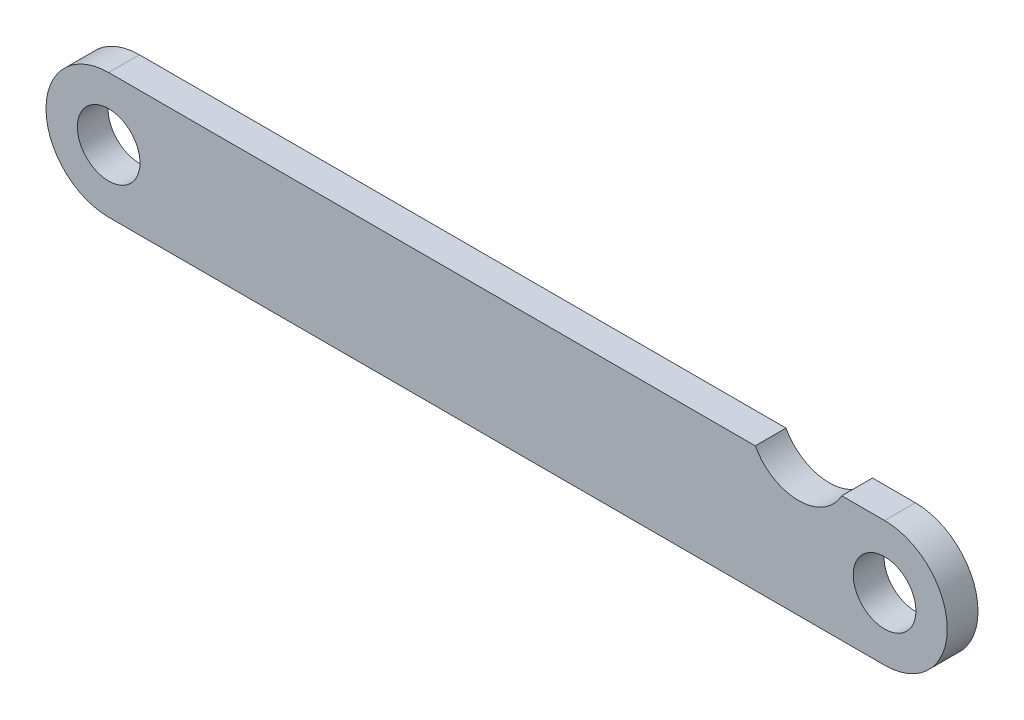
ISO-10303-21;
HEADER;
FILE_DESCRIPTION(('STEP AP214'),'2;1');
FILE_NAME('part.step','',(''),(''),'','','');
FILE_SCHEMA(('AUTOMOTIVE_DESIGN { 1 0 10303 214 1 1 1 1 }'));
ENDSEC;
DATA;
#1=APPLICATION_CONTEXT('core data for automotive mechanical design processes');
#2=APPLICATION_PROTOCOL_DEFINITION('international standard','automotive_design',2000,#1);
#3=PRODUCT_CONTEXT('',#1,'mechanical');
#4=PRODUCT('Part','Part','',(#3));
#5=PRODUCT_RELATED_PRODUCT_CATEGORY('part','',(#4));
#6=PRODUCT_DEFINITION_FORMATION('','',#4);
#7=PRODUCT_DEFINITION_CONTEXT('part definition',#1,'design');
#8=PRODUCT_DEFINITION('design','',#6,#7);
#9=PRODUCT_DEFINITION_SHAPE('','',#8);
#10=(LENGTH_UNIT() NAMED_UNIT(*) SI_UNIT(.MILLI.,.METRE.));
#11=(NAMED_UNIT(*) PLANE_ANGLE_UNIT() SI_UNIT($,.RADIAN.));
#12=(NAMED_UNIT(*) SI_UNIT($,.STERADIAN.) SOLID_ANGLE_UNIT());
#13=UNCERTAINTY_MEASURE_WITH_UNIT(LENGTH_MEASURE(1.E-05),#10,'distance_accuracy_value','');
#14=(GEOMETRIC_REPRESENTATION_CONTEXT(3) GLOBAL_UNCERTAINTY_ASSIGNED_CONTEXT((#13)) GLOBAL_UNIT_ASSIGNED_CONTEXT((#10,
#11,#12)) REPRESENTATION_CONTEXT('',''));
#15=CARTESIAN_POINT('',(0.,0.,0.));
#16=DIRECTION('',(0.,0.,1.));
#17=DIRECTION('',(1.,0.,0.));
#18=AXIS2_PLACEMENT_3D('',#15,#16,#17);
#19=CARTESIAN_POINT('',(0.,2.03803107941855,1.));
#20=DIRECTION('',(0.,1.,0.));
#21=DIRECTION('',(-1.,0.,0.));
#22=AXIS2_PLACEMENT_3D('',#19,#20,#21);
#23=PLANE('',#22);
#24=DIRECTION('',(1.,0.,0.));
#25=VECTOR('',#24,1.);
#26=CARTESIAN_POINT('',(0.,2.03803107941855,0.));
#27=LINE('',#26,#25);
#28=CARTESIAN_POINT('',(-1.39308729337321,2.03803107941855,0.));
#29=VERTEX_POINT('',#28);
#30=CARTESIAN_POINT('',(0.,2.03803107941855,0.));
#31=VERTEX_POINT('',#30);
#32=EDGE_CURVE('E94',#29,#31,#27,.T.);
#33=ORIENTED_EDGE('',*,*,#32,.F.);
#34=DIRECTION('',(0.,0.,-1.));
#35=VECTOR('',#34,1.);
#36=CARTESIAN_POINT('',(-1.39308729337321,2.03803107941855,1.));
#37=LINE('',#36,#35);
#38=CARTESIAN_POINT('',(-1.39308729337321,2.03803107941855,1.));
#39=VERTEX_POINT('',#38);
#40=EDGE_CURVE('E65',#29,#39,#37,.F.);
#41=ORIENTED_EDGE('',*,*,#40,.T.);
#42=DIRECTION('',(1.,0.,0.));
#43=VECTOR('',#42,1.);
#44=CARTESIAN_POINT('',(0.,2.03803107941855,1.));
#45=LINE('',#44,#43);
#46=CARTESIAN_POINT('',(0.,2.03803107941855,1.));
#47=VERTEX_POINT('',#46);
#48=EDGE_CURVE('E73',#39,#47,#45,.T.);
#49=ORIENTED_EDGE('',*,*,#48,.T.);
#50=DIRECTION('',(0.,0.,-1.));
#51=VECTOR('',#50,1.);
#52=CARTESIAN_POINT('',(0.,2.03803107941855,1.));
#53=LINE('',#52,#51);
#54=EDGE_CURVE('E139',#47,#31,#53,.T.);
#55=ORIENTED_EDGE('',*,*,#54,.T.);
#56=EDGE_LOOP('',(#33,#41,#49,#55));
#57=FACE_BOUND('',#56,.T.);
#58=ADVANCED_FACE('F51',(#57),#23,.T.);
#59=CARTESIAN_POINT('',(-25.234342,2.03803107941855,1.));
#60=VERTEX_POINT('',#59);
#61=CARTESIAN_POINT('',(-4.2069127066268,2.03803107941855,1.));
#62=VERTEX_POINT('',#61);
#63=EDGE_CURVE('E120',#60,#62,#45,.T.);
#64=ORIENTED_EDGE('',*,*,#63,.T.);
#65=DIRECTION('',(0.,0.,-1.));
#66=VECTOR('',#65,1.);
#67=CARTESIAN_POINT('',(-4.2069127066268,2.03803107941855,1.));
#68=LINE('',#67,#66);
#69=CARTESIAN_POINT('',(-4.2069127066268,2.03803107941855,0.));
#70=VERTEX_POINT('',#69);
#71=EDGE_CURVE('E109',#62,#70,#68,.T.);
#72=ORIENTED_EDGE('',*,*,#71,.T.);
#73=CARTESIAN_POINT('',(-25.234342,2.03803107941855,0.));
#74=VERTEX_POINT('',#73);
#75=EDGE_CURVE('E140',#74,#70,#27,.T.);
#76=ORIENTED_EDGE('',*,*,#75,.F.);
#77=DIRECTION('',(0.,0.,-1.));
#78=VECTOR('',#77,1.);
#79=CARTESIAN_POINT('',(-25.234342,2.03803107941855,1.));
#80=LINE('',#79,#78);
#81=EDGE_CURVE('E13',#60,#74,#80,.T.);
#82=ORIENTED_EDGE('',*,*,#81,.F.);
#83=EDGE_LOOP('',(#64,#72,#76,#82));
#84=FACE_BOUND('',#83,.T.);
#85=ADVANCED_FACE('F122',(#84),#23,.T.);
#86=CARTESIAN_POINT('',(-25.234342,0.,1.));
#87=DIRECTION('',(0.,0.,-1.));
#88=DIRECTION('',(-1.,0.,0.));
#89=AXIS2_PLACEMENT_3D('',#86,#87,#88);
#90=CYLINDRICAL_SURFACE('',#89,2.03803107941855);
#91=CARTESIAN_POINT('',(-25.234342,0.,0.));
#92=DIRECTION('',(0.,0.,1.));
#93=DIRECTION('',(1.,0.,0.));
#94=AXIS2_PLACEMENT_3D('',#91,#92,#93);
#95=CIRCLE('',#94,2.03803107941855);
#96=CARTESIAN_POINT('',(-25.234342,-2.03803107941855,0.));
#97=VERTEX_POINT('',#96);
#98=EDGE_CURVE('E142',#74,#97,#95,.T.);
#99=ORIENTED_EDGE('',*,*,#98,.T.);
#100=DIRECTION('',(0.,0.,-1.));
#101=VECTOR('',#100,1.);
#102=CARTESIAN_POINT('',(-25.234342,-2.03803107941855,1.));
#103=LINE('',#102,#101);
#104=CARTESIAN_POINT('',(-25.234342,-2.03803107941855,1.));
#105=VERTEX_POINT('',#104);
#106=EDGE_CURVE('E58',#105,#97,#103,.T.);
#107=ORIENTED_EDGE('',*,*,#106,.F.);
#108=CARTESIAN_POINT('',(-25.234342,0.,1.));
#109=DIRECTION('',(0.,0.,1.));
#110=DIRECTION('',(1.,0.,0.));
#111=AXIS2_PLACEMENT_3D('',#108,#109,#110);
#112=CIRCLE('',#111,2.03803107941855);
#113=EDGE_CURVE('E123',#60,#105,#112,.T.);
#114=ORIENTED_EDGE('',*,*,#113,.F.);
#115=ORIENTED_EDGE('',*,*,#81,.T.);
#116=EDGE_LOOP('',(#99,#107,#114,#115));
#117=FACE_BOUND('',#116,.T.);
#118=ADVANCED_FACE('F172',(#117),#90,.T.);
#119=CARTESIAN_POINT('',(0.,-2.03803107941855,1.));
#120=DIRECTION('',(0.,1.,0.));
#121=DIRECTION('',(-1.,0.,0.));
#122=AXIS2_PLACEMENT_3D('',#119,#120,#121);
#123=PLANE('',#122);
#124=DIRECTION('',(1.,0.,0.));
#125=VECTOR('',#124,1.);
#126=CARTESIAN_POINT('',(0.,-2.03803107941855,0.));
#127=LINE('',#126,#125);
#128=CARTESIAN_POINT('',(0.,-2.03803107941855,0.));
#129=VERTEX_POINT('',#128);
#130=EDGE_CURVE('E144',#97,#129,#127,.T.);
#131=ORIENTED_EDGE('',*,*,#130,.T.);
#132=DIRECTION('',(0.,0.,-1.));
#133=VECTOR('',#132,1.);
#134=CARTESIAN_POINT('',(0.,-2.03803107941855,1.));
#135=LINE('',#134,#133);
#136=CARTESIAN_POINT('',(0.,-2.03803107941855,1.));
#137=VERTEX_POINT('',#136);
#138=EDGE_CURVE('E155',#137,#129,#135,.T.);
#139=ORIENTED_EDGE('',*,*,#138,.F.);
#140=DIRECTION('',(1.,0.,0.));
#141=VECTOR('',#140,1.);
#142=CARTESIAN_POINT('',(0.,-2.03803107941855,1.));
#143=LINE('',#142,#141);
#144=EDGE_CURVE('E125',#105,#137,#143,.T.);
#145=ORIENTED_EDGE('',*,*,#144,.F.);
#146=ORIENTED_EDGE('',*,*,#106,.T.);
#147=EDGE_LOOP('',(#131,#139,#145,#146));
#148=FACE_BOUND('',#147,.T.);
#149=ADVANCED_FACE('F162',(#148),#123,.F.);
#150=CARTESIAN_POINT('',(0.,0.,1.));
#151=DIRECTION('',(0.,0.,-1.));
#152=DIRECTION('',(-1.,0.,0.));
#153=AXIS2_PLACEMENT_3D('',#150,#151,#152);
#154=CYLINDRICAL_SURFACE('',#153,1.01901553970927);
#155=CARTESIAN_POINT('',(0.,0.,1.));
#156=DIRECTION('',(0.,0.,1.));
#157=DIRECTION('',(1.,0.,0.));
#158=AXIS2_PLACEMENT_3D('',#155,#156,#157);
#159=CIRCLE('',#158,1.01901553970927);
#160=CARTESIAN_POINT('',(1.01901553970927,0.,1.));
#161=VERTEX_POINT('',#160);
#162=EDGE_CURVE('E133',#161,#161,#159,.T.);
#163=ORIENTED_EDGE('',*,*,#162,.T.);
#164=EDGE_LOOP('',(#163));
#165=FACE_BOUND('',#164,.T.);
#166=CARTESIAN_POINT('',(0.,0.,0.));
#167=DIRECTION('',(0.,0.,1.));
#168=DIRECTION('',(1.,0.,0.));
#169=AXIS2_PLACEMENT_3D('',#166,#167,#168);
#170=CIRCLE('',#169,1.01901553970927);
#171=CARTESIAN_POINT('',(1.01901553970927,0.,0.));
#172=VERTEX_POINT('',#171);
#173=EDGE_CURVE('E149',#172,#172,#170,.T.);
#174=ORIENTED_EDGE('',*,*,#173,.F.);
#175=EDGE_LOOP('',(#174));
#176=FACE_BOUND('',#175,.T.);
#177=ADVANCED_FACE('F178',(#165,#176),#154,.F.);
#178=CARTESIAN_POINT('',(0.,0.,1.));
#179=DIRECTION('',(0.,0.,-1.));
#180=DIRECTION('',(-1.,0.,0.));
#181=AXIS2_PLACEMENT_3D('',#178,#179,#180);
#182=CYLINDRICAL_SURFACE('',#181,2.03803107941855);
#183=CARTESIAN_POINT('',(0.,0.,0.));
#184=DIRECTION('',(0.,0.,1.));
#185=DIRECTION('',(1.,0.,0.));
#186=AXIS2_PLACEMENT_3D('',#183,#184,#185);
#187=CIRCLE('',#186,2.03803107941855);
#188=EDGE_CURVE('E146',#129,#31,#187,.T.);
#189=ORIENTED_EDGE('',*,*,#188,.T.);
#190=ORIENTED_EDGE('',*,*,#54,.F.);
#191=CARTESIAN_POINT('',(0.,0.,1.));
#192=DIRECTION('',(0.,0.,1.));
#193=DIRECTION('',(1.,0.,0.));
#194=AXIS2_PLACEMENT_3D('',#191,#192,#193);
#195=CIRCLE('',#194,2.03803107941855);
#196=EDGE_CURVE('E131',#137,#47,#195,.T.);
#197=ORIENTED_EDGE('',*,*,#196,.F.);
#198=ORIENTED_EDGE('',*,*,#138,.T.);
#199=EDGE_LOOP('',(#189,#190,#197,#198));
#200=FACE_BOUND('',#199,.T.);
#201=ADVANCED_FACE('F170',(#200),#182,.T.);
#202=CARTESIAN_POINT('',(-25.234342,0.,1.));
#203=DIRECTION('',(0.,0.,-1.));
#204=DIRECTION('',(-1.,0.,0.));
#205=AXIS2_PLACEMENT_3D('',#202,#203,#204);
#206=CYLINDRICAL_SURFACE('',#205,1.01901553970927);
#207=CARTESIAN_POINT('',(-25.234342,0.,1.));
#208=DIRECTION('',(0.,0.,1.));
#209=DIRECTION('',(1.,0.,0.));
#210=AXIS2_PLACEMENT_3D('',#207,#208,#209);
#211=CIRCLE('',#210,1.01901553970927);
#212=CARTESIAN_POINT('',(-24.2153264602907,0.,1.));
#213=VERTEX_POINT('',#212);
#214=EDGE_CURVE('E136',#213,#213,#211,.T.);
#215=ORIENTED_EDGE('',*,*,#214,.T.);
#216=EDGE_LOOP('',(#215));
#217=FACE_BOUND('',#216,.T.);
#218=CARTESIAN_POINT('',(-25.234342,0.,0.));
#219=DIRECTION('',(0.,0.,1.));
#220=DIRECTION('',(1.,0.,0.));
#221=AXIS2_PLACEMENT_3D('',#218,#219,#220);
#222=CIRCLE('',#221,1.01901553970927);
#223=CARTESIAN_POINT('',(-24.2153264602907,0.,0.));
#224=VERTEX_POINT('',#223);
#225=EDGE_CURVE('E127',#224,#224,#222,.T.);
#226=ORIENTED_EDGE('',*,*,#225,.F.);
#227=EDGE_LOOP('',(#226));
#228=FACE_BOUND('',#227,.T.);
#229=ADVANCED_FACE('F198',(#217,#228),#206,.F.);
#230=CARTESIAN_POINT('',(0.,0.,1.));
#231=DIRECTION('',(0.,0.,1.));
#232=DIRECTION('',(1.,0.,0.));
#233=AXIS2_PLACEMENT_3D('',#230,#231,#232);
#234=PLANE('',#233);
#235=ORIENTED_EDGE('',*,*,#48,.F.);
#236=CARTESIAN_POINT('',(-2.80000000000001,2.8,1.));
#237=DIRECTION('',(0.,0.,1.));
#238=DIRECTION('',(1.,0.,0.));
#239=AXIS2_PLACEMENT_3D('',#236,#237,#238);
#240=CIRCLE('',#239,1.6);
#241=EDGE_CURVE('E112',#62,#39,#240,.T.);
#242=ORIENTED_EDGE('',*,*,#241,.F.);
#243=ORIENTED_EDGE('',*,*,#63,.F.);
#244=ORIENTED_EDGE('',*,*,#113,.T.);
#245=ORIENTED_EDGE('',*,*,#144,.T.);
#246=ORIENTED_EDGE('',*,*,#196,.T.);
#247=EDGE_LOOP('',(#235,#242,#243,#244,#245,#246));
#248=FACE_BOUND('',#247,.T.);
#249=ORIENTED_EDGE('',*,*,#162,.F.);
#250=EDGE_LOOP('',(#249));
#251=FACE_BOUND('',#250,.T.);
#252=ORIENTED_EDGE('',*,*,#214,.F.);
#253=EDGE_LOOP('',(#252));
#254=FACE_BOUND('',#253,.T.);
#255=ADVANCED_FACE('F118',(#248,#251,#254),#234,.T.);
#256=CARTESIAN_POINT('',(0.,0.,0.));
#257=DIRECTION('',(0.,0.,1.));
#258=DIRECTION('',(1.,0.,0.));
#259=AXIS2_PLACEMENT_3D('',#256,#257,#258);
#260=PLANE('',#259);
#261=CARTESIAN_POINT('',(-2.80000000000001,2.8,0.));
#262=DIRECTION('',(0.,0.,1.));
#263=DIRECTION('',(1.,0.,0.));
#264=AXIS2_PLACEMENT_3D('',#261,#262,#263);
#265=CIRCLE('',#264,1.6);
#266=EDGE_CURVE('E113',#70,#29,#265,.T.);
#267=ORIENTED_EDGE('',*,*,#266,.T.);
#268=ORIENTED_EDGE('',*,*,#32,.T.);
#269=ORIENTED_EDGE('',*,*,#188,.F.);
#270=ORIENTED_EDGE('',*,*,#130,.F.);
#271=ORIENTED_EDGE('',*,*,#98,.F.);
#272=ORIENTED_EDGE('',*,*,#75,.T.);
#273=EDGE_LOOP('',(#267,#268,#269,#270,#271,#272));
#274=FACE_BOUND('',#273,.T.);
#275=ORIENTED_EDGE('',*,*,#173,.T.);
#276=EDGE_LOOP('',(#275));
#277=FACE_BOUND('',#276,.T.);
#278=ORIENTED_EDGE('',*,*,#225,.T.);
#279=EDGE_LOOP('',(#278));
#280=FACE_BOUND('',#279,.T.);
#281=ADVANCED_FACE('F166',(#274,#277,#280),#260,.F.);
#282=CARTESIAN_POINT('',(-2.80000000000001,2.8,1.));
#283=DIRECTION('',(0.,0.,-1.));
#284=DIRECTION('',(-1.,0.,0.));
#285=AXIS2_PLACEMENT_3D('',#282,#283,#284);
#286=CYLINDRICAL_SURFACE('',#285,1.6);
#287=ORIENTED_EDGE('',*,*,#266,.F.);
#288=ORIENTED_EDGE('',*,*,#71,.F.);
#289=ORIENTED_EDGE('',*,*,#241,.T.);
#290=ORIENTED_EDGE('',*,*,#40,.F.);
#291=EDGE_LOOP('',(#287,#288,#289,#290));
#292=FACE_BOUND('',#291,.T.);
#293=ADVANCED_FACE('F111',(#292),#286,.F.);
#294=CLOSED_SHELL('',(#58,#85,#118,#149,#177,#201,#229,#255,#281,#293));
#295=MANIFOLD_SOLID_BREP('B2',#294);
#296=ADVANCED_BREP_SHAPE_REPRESENTATION('',(#18,#295),#14);
#297=SHAPE_DEFINITION_REPRESENTATION(#9,#296);
ENDSEC;
END-ISO-10303-21;
